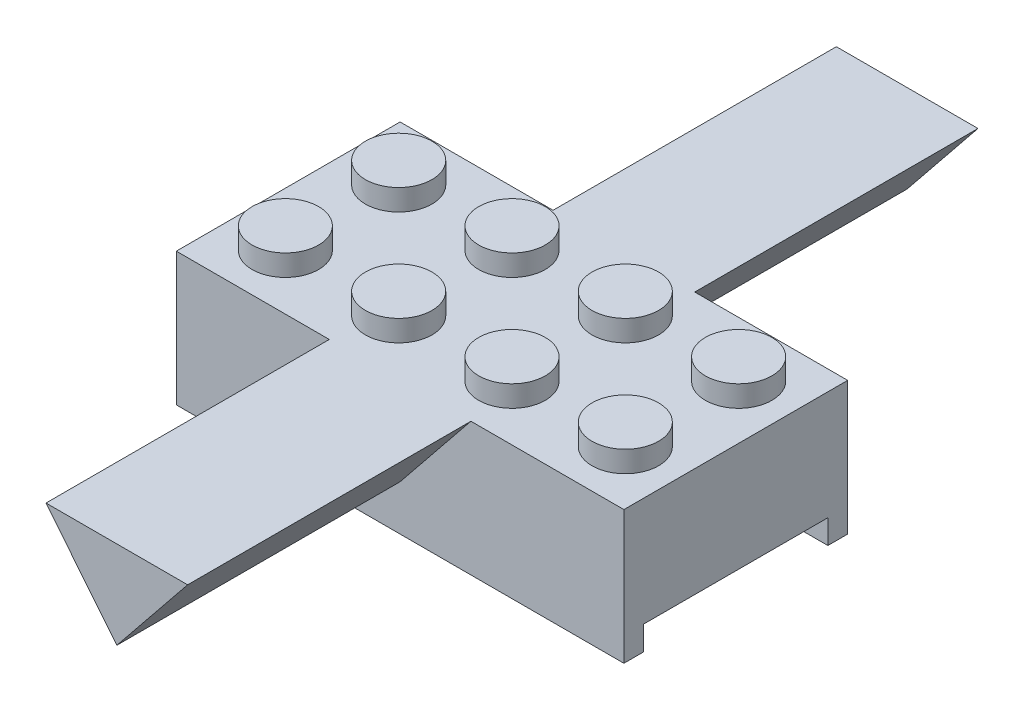
ISO-10303-21;
HEADER;
FILE_DESCRIPTION(('STEP AP214'),'2;1');
FILE_NAME('part.step','',(''),(''),'','','');
FILE_SCHEMA(('AUTOMOTIVE_DESIGN { 1 0 10303 214 1 1 1 1 }'));
ENDSEC;
DATA;
#1=APPLICATION_CONTEXT('core data for automotive mechanical design processes');
#2=APPLICATION_PROTOCOL_DEFINITION('international standard','automotive_design',2000,#1);
#3=PRODUCT_CONTEXT('',#1,'mechanical');
#4=PRODUCT('Part','Part','',(#3));
#5=PRODUCT_RELATED_PRODUCT_CATEGORY('part','',(#4));
#6=PRODUCT_DEFINITION_FORMATION('','',#4);
#7=PRODUCT_DEFINITION_CONTEXT('part definition',#1,'design');
#8=PRODUCT_DEFINITION('design','',#6,#7);
#9=PRODUCT_DEFINITION_SHAPE('','',#8);
#10=(LENGTH_UNIT() NAMED_UNIT(*) SI_UNIT(.MILLI.,.METRE.));
#11=(NAMED_UNIT(*) PLANE_ANGLE_UNIT() SI_UNIT($,.RADIAN.));
#12=(NAMED_UNIT(*) SI_UNIT($,.STERADIAN.) SOLID_ANGLE_UNIT());
#13=UNCERTAINTY_MEASURE_WITH_UNIT(LENGTH_MEASURE(1.E-05),#10,'distance_accuracy_value','');
#14=(GEOMETRIC_REPRESENTATION_CONTEXT(3) GLOBAL_UNCERTAINTY_ASSIGNED_CONTEXT((#13)) GLOBAL_UNIT_ASSIGNED_CONTEXT((#10,
#11,#12)) REPRESENTATION_CONTEXT('',''));
#15=CARTESIAN_POINT('',(0.,0.,0.));
#16=DIRECTION('',(0.,0.,1.));
#17=DIRECTION('',(1.,0.,0.));
#18=AXIS2_PLACEMENT_3D('',#15,#16,#17);
#19=CARTESIAN_POINT('',(-17.1542857142857,9.4,8.35142857142857));
#20=DIRECTION('',(0.,0.,-1.));
#21=DIRECTION('',(-1.,0.,0.));
#22=AXIS2_PLACEMENT_3D('',#19,#20,#21);
#23=PLANE('',#22);
#24=DIRECTION('',(0.627752451189782,0.778413039475329,0.));
#25=VECTOR('',#24,1.);
#26=CARTESIAN_POINT('',(-1.35428571428571,3.2,8.35142857142857));
#27=LINE('',#26,#25);
#28=CARTESIAN_POINT('',(-1.35428571428571,3.2,8.35142857142857));
#29=VERTEX_POINT('',#28);
#30=CARTESIAN_POINT('',(3.64571428571429,9.4,8.35142857142857));
#31=VERTEX_POINT('',#30);
#32=EDGE_CURVE('E150',#29,#31,#27,.T.);
#33=ORIENTED_EDGE('',*,*,#32,.F.);
#34=DIRECTION('',(0.627752451189782,-0.778413039475329,0.));
#35=VECTOR('',#34,1.);
#36=CARTESIAN_POINT('',(-6.35428571428572,9.4,8.35142857142857));
#37=LINE('',#36,#35);
#38=CARTESIAN_POINT('',(-6.35428571428571,9.4,8.35142857142857));
#39=VERTEX_POINT('',#38);
#40=EDGE_CURVE('E54',#39,#29,#37,.T.);
#41=ORIENTED_EDGE('',*,*,#40,.F.);
#42=DIRECTION('',(1.,0.,0.));
#43=VECTOR('',#42,1.);
#44=CARTESIAN_POINT('',(-17.1542857142857,9.4,8.35142857142857));
#45=LINE('',#44,#43);
#46=CARTESIAN_POINT('',(-17.1542857142857,9.4,8.35142857142857));
#47=VERTEX_POINT('',#46);
#48=EDGE_CURVE('E154',#47,#39,#45,.T.);
#49=ORIENTED_EDGE('',*,*,#48,.F.);
#50=DIRECTION('',(0.,-1.,0.));
#51=VECTOR('',#50,1.);
#52=CARTESIAN_POINT('',(-17.1542857142857,9.4,8.35142857142857));
#53=LINE('',#52,#51);
#54=CARTESIAN_POINT('',(-17.1542857142857,0.,8.35142857142857));
#55=VERTEX_POINT('',#54);
#56=EDGE_CURVE('E11',#47,#55,#53,.T.);
#57=ORIENTED_EDGE('',*,*,#56,.T.);
#58=DIRECTION('',(1.,0.,0.));
#59=VECTOR('',#58,1.);
#60=CARTESIAN_POINT('',(-17.1542857142857,0.,8.35142857142857));
#61=LINE('',#60,#59);
#62=CARTESIAN_POINT('',(14.4457142857143,0.,8.35142857142857));
#63=VERTEX_POINT('',#62);
#64=EDGE_CURVE('E222',#55,#63,#61,.T.);
#65=ORIENTED_EDGE('',*,*,#64,.T.);
#66=DIRECTION('',(0.,-1.,0.));
#67=VECTOR('',#66,1.);
#68=CARTESIAN_POINT('',(14.4457142857143,9.4,8.35142857142857));
#69=LINE('',#68,#67);
#70=CARTESIAN_POINT('',(14.4457142857143,9.4,8.35142857142857));
#71=VERTEX_POINT('',#70);
#72=EDGE_CURVE('E41',#71,#63,#69,.T.);
#73=ORIENTED_EDGE('',*,*,#72,.F.);
#74=EDGE_CURVE('E48',#31,#71,#45,.T.);
#75=ORIENTED_EDGE('',*,*,#74,.F.);
#76=EDGE_LOOP('',(#33,#41,#49,#57,#65,#73,#75));
#77=FACE_BOUND('',#76,.T.);
#78=ADVANCED_FACE('F33',(#77),#23,.F.);
#79=CARTESIAN_POINT('',(-17.1542857142857,9.4,-7.44857142857143));
#80=DIRECTION('',(0.,0.,1.));
#81=DIRECTION('',(1.,0.,0.));
#82=AXIS2_PLACEMENT_3D('',#79,#80,#81);
#83=PLANE('',#82);
#84=DIRECTION('',(-0.627752451189782,0.778413039475329,0.));
#85=VECTOR('',#84,1.);
#86=CARTESIAN_POINT('',(-1.35428571428571,3.2,-7.44857142857143));
#87=LINE('',#86,#85);
#88=CARTESIAN_POINT('',(-1.35428571428571,3.2,-7.44857142857143));
#89=VERTEX_POINT('',#88);
#90=CARTESIAN_POINT('',(-6.35428571428572,9.4,-7.44857142857143));
#91=VERTEX_POINT('',#90);
#92=EDGE_CURVE('E158',#89,#91,#87,.T.);
#93=ORIENTED_EDGE('',*,*,#92,.F.);
#94=DIRECTION('',(-0.627752451189782,-0.778413039475329,0.));
#95=VECTOR('',#94,1.);
#96=CARTESIAN_POINT('',(3.64571428571429,9.4,-7.44857142857143));
#97=LINE('',#96,#95);
#98=CARTESIAN_POINT('',(3.64571428571428,9.4,-7.44857142857143));
#99=VERTEX_POINT('',#98);
#100=EDGE_CURVE('E155',#99,#89,#97,.T.);
#101=ORIENTED_EDGE('',*,*,#100,.F.);
#102=DIRECTION('',(-1.,0.,0.));
#103=VECTOR('',#102,1.);
#104=CARTESIAN_POINT('',(-17.1542857142857,9.4,-7.44857142857143));
#105=LINE('',#104,#103);
#106=CARTESIAN_POINT('',(14.4457142857143,9.4,-7.44857142857143));
#107=VERTEX_POINT('',#106);
#108=EDGE_CURVE('E215',#107,#99,#105,.T.);
#109=ORIENTED_EDGE('',*,*,#108,.F.);
#110=DIRECTION('',(0.,-1.,0.));
#111=VECTOR('',#110,1.);
#112=CARTESIAN_POINT('',(14.4457142857143,9.4,-7.44857142857143));
#113=LINE('',#112,#111);
#114=CARTESIAN_POINT('',(14.4457142857143,0.,-7.44857142857143));
#115=VERTEX_POINT('',#114);
#116=EDGE_CURVE('E231',#107,#115,#113,.T.);
#117=ORIENTED_EDGE('',*,*,#116,.T.);
#118=DIRECTION('',(-1.,0.,0.));
#119=VECTOR('',#118,1.);
#120=CARTESIAN_POINT('',(-17.1542857142857,0.,-7.44857142857143));
#121=LINE('',#120,#119);
#122=CARTESIAN_POINT('',(-17.1542857142857,0.,-7.44857142857143));
#123=VERTEX_POINT('',#122);
#124=EDGE_CURVE('E210',#115,#123,#121,.T.);
#125=ORIENTED_EDGE('',*,*,#124,.T.);
#126=DIRECTION('',(0.,-1.,0.));
#127=VECTOR('',#126,1.);
#128=CARTESIAN_POINT('',(-17.1542857142857,9.4,-7.44857142857143));
#129=LINE('',#128,#127);
#130=CARTESIAN_POINT('',(-17.1542857142857,9.4,-7.44857142857143));
#131=VERTEX_POINT('',#130);
#132=EDGE_CURVE('E218',#131,#123,#129,.T.);
#133=ORIENTED_EDGE('',*,*,#132,.F.);
#134=EDGE_CURVE('E214',#91,#131,#105,.T.);
#135=ORIENTED_EDGE('',*,*,#134,.F.);
#136=EDGE_LOOP('',(#93,#101,#109,#117,#125,#133,#135));
#137=FACE_BOUND('',#136,.T.);
#138=ADVANCED_FACE('F265',(#137),#83,.F.);
#139=CARTESIAN_POINT('',(0.,0.,0.));
#140=DIRECTION('',(0.,1.,0.));
#141=DIRECTION('',(0.,0.,1.));
#142=AXIS2_PLACEMENT_3D('',#139,#140,#141);
#143=PLANE('',#142);
#144=DIRECTION('',(0.,0.,-1.));
#145=VECTOR('',#144,1.);
#146=CARTESIAN_POINT('',(14.4457142857143,0.,-7.44857142857143));
#147=LINE('',#146,#145);
#148=CARTESIAN_POINT('',(14.4457142857143,0.,-6.04857142857143));
#149=VERTEX_POINT('',#148);
#150=EDGE_CURVE('E224',#149,#115,#147,.T.);
#151=ORIENTED_EDGE('',*,*,#150,.F.);
#152=DIRECTION('',(1.,0.,0.));
#153=VECTOR('',#152,1.);
#154=CARTESIAN_POINT('',(14.4457142857143,0.,-6.04857142857143));
#155=LINE('',#154,#153);
#156=CARTESIAN_POINT('',(-17.1542857142857,0.,-6.04857142857143));
#157=VERTEX_POINT('',#156);
#158=EDGE_CURVE('E187',#157,#149,#155,.T.);
#159=ORIENTED_EDGE('',*,*,#158,.F.);
#160=DIRECTION('',(0.,0.,1.));
#161=VECTOR('',#160,1.);
#162=CARTESIAN_POINT('',(-17.1542857142857,0.,-7.44857142857143));
#163=LINE('',#162,#161);
#164=EDGE_CURVE('E219',#123,#157,#163,.T.);
#165=ORIENTED_EDGE('',*,*,#164,.F.);
#166=ORIENTED_EDGE('',*,*,#124,.F.);
#167=EDGE_LOOP('',(#151,#159,#165,#166));
#168=FACE_BOUND('',#167,.T.);
#169=ADVANCED_FACE('F261',(#168),#143,.F.);
#170=CARTESIAN_POINT('',(-17.1542857142857,9.4,-7.44857142857143));
#171=DIRECTION('',(1.,0.,0.));
#172=DIRECTION('',(0.,0.,-1.));
#173=AXIS2_PLACEMENT_3D('',#170,#171,#172);
#174=PLANE('',#173);
#175=ORIENTED_EDGE('',*,*,#164,.T.);
#176=DIRECTION('',(0.,-1.,0.));
#177=VECTOR('',#176,1.);
#178=CARTESIAN_POINT('',(-17.1542857142857,1.7,-6.04857142857143));
#179=LINE('',#178,#177);
#180=CARTESIAN_POINT('',(-17.1542857142857,1.7,-6.04857142857143));
#181=VERTEX_POINT('',#180);
#182=EDGE_CURVE('E202',#181,#157,#179,.T.);
#183=ORIENTED_EDGE('',*,*,#182,.F.);
#184=DIRECTION('',(0.,0.,-1.));
#185=VECTOR('',#184,1.);
#186=CARTESIAN_POINT('',(-17.1542857142857,1.7,6.95142857142857));
#187=LINE('',#186,#185);
#188=CARTESIAN_POINT('',(-17.1542857142857,1.7,6.95142857142857));
#189=VERTEX_POINT('',#188);
#190=EDGE_CURVE('E190',#189,#181,#187,.T.);
#191=ORIENTED_EDGE('',*,*,#190,.F.);
#192=DIRECTION('',(0.,-1.,0.));
#193=VECTOR('',#192,1.);
#194=CARTESIAN_POINT('',(-17.1542857142857,1.7,6.95142857142857));
#195=LINE('',#194,#193);
#196=CARTESIAN_POINT('',(-17.1542857142857,0.,6.95142857142857));
#197=VERTEX_POINT('',#196);
#198=EDGE_CURVE('E204',#189,#197,#195,.T.);
#199=ORIENTED_EDGE('',*,*,#198,.T.);
#200=EDGE_CURVE('E201',#197,#55,#163,.T.);
#201=ORIENTED_EDGE('',*,*,#200,.T.);
#202=ORIENTED_EDGE('',*,*,#56,.F.);
#203=DIRECTION('',(0.,0.,1.));
#204=VECTOR('',#203,1.);
#205=CARTESIAN_POINT('',(-17.1542857142857,9.4,-7.44857142857143));
#206=LINE('',#205,#204);
#207=EDGE_CURVE('E208',#131,#47,#206,.T.);
#208=ORIENTED_EDGE('',*,*,#207,.F.);
#209=ORIENTED_EDGE('',*,*,#132,.T.);
#210=EDGE_LOOP('',(#175,#183,#191,#199,#201,#202,#208,#209));
#211=FACE_BOUND('',#210,.T.);
#212=ADVANCED_FACE('F35',(#211),#174,.F.);
#213=CARTESIAN_POINT('',(14.4457142857143,9.4,-7.44857142857143));
#214=DIRECTION('',(-1.,0.,0.));
#215=DIRECTION('',(0.,0.,1.));
#216=AXIS2_PLACEMENT_3D('',#213,#214,#215);
#217=PLANE('',#216);
#218=DIRECTION('',(0.,0.,1.));
#219=VECTOR('',#218,1.);
#220=CARTESIAN_POINT('',(14.4457142857143,1.7,6.95142857142857));
#221=LINE('',#220,#219);
#222=CARTESIAN_POINT('',(14.4457142857143,1.7,-6.04857142857143));
#223=VERTEX_POINT('',#222);
#224=CARTESIAN_POINT('',(14.4457142857143,1.7,6.95142857142857));
#225=VERTEX_POINT('',#224);
#226=EDGE_CURVE('E183',#223,#225,#221,.T.);
#227=ORIENTED_EDGE('',*,*,#226,.F.);
#228=DIRECTION('',(0.,-1.,0.));
#229=VECTOR('',#228,1.);
#230=CARTESIAN_POINT('',(14.4457142857143,1.7,-6.04857142857143));
#231=LINE('',#230,#229);
#232=EDGE_CURVE('E198',#223,#149,#231,.T.);
#233=ORIENTED_EDGE('',*,*,#232,.T.);
#234=ORIENTED_EDGE('',*,*,#150,.T.);
#235=ORIENTED_EDGE('',*,*,#116,.F.);
#236=DIRECTION('',(0.,0.,-1.));
#237=VECTOR('',#236,1.);
#238=CARTESIAN_POINT('',(14.4457142857143,9.4,-7.44857142857143));
#239=LINE('',#238,#237);
#240=EDGE_CURVE('E212',#71,#107,#239,.T.);
#241=ORIENTED_EDGE('',*,*,#240,.F.);
#242=ORIENTED_EDGE('',*,*,#72,.T.);
#243=CARTESIAN_POINT('',(14.4457142857143,0.,6.95142857142857));
#244=VERTEX_POINT('',#243);
#245=EDGE_CURVE('E225',#63,#244,#147,.T.);
#246=ORIENTED_EDGE('',*,*,#245,.T.);
#247=DIRECTION('',(0.,-1.,0.));
#248=VECTOR('',#247,1.);
#249=CARTESIAN_POINT('',(14.4457142857143,1.7,6.95142857142857));
#250=LINE('',#249,#248);
#251=EDGE_CURVE('E195',#225,#244,#250,.T.);
#252=ORIENTED_EDGE('',*,*,#251,.F.);
#253=EDGE_LOOP('',(#227,#233,#234,#235,#241,#242,#246,#252));
#254=FACE_BOUND('',#253,.T.);
#255=ADVANCED_FACE('F238',(#254),#217,.F.);
#256=CARTESIAN_POINT('',(0.,9.4,0.));
#257=DIRECTION('',(0.,1.,0.));
#258=DIRECTION('',(0.,0.,1.));
#259=AXIS2_PLACEMENT_3D('',#256,#257,#258);
#260=PLANE('',#259);
#261=CARTESIAN_POINT('',(10.6457142857143,9.4,-3.54857142857143));
#262=DIRECTION('',(0.,1.,0.));
#263=DIRECTION('',(0.,0.,1.));
#264=AXIS2_PLACEMENT_3D('',#261,#262,#263);
#265=CIRCLE('',#264,2.35);
#266=CARTESIAN_POINT('',(10.6457142857143,9.4,-1.19857142857143));
#267=VERTEX_POINT('',#266);
#268=EDGE_CURVE('E325',#267,#267,#265,.T.);
#269=ORIENTED_EDGE('',*,*,#268,.F.);
#270=EDGE_LOOP('',(#269));
#271=FACE_BOUND('',#270,.T.);
#272=CARTESIAN_POINT('',(-13.3542857142857,9.4,-3.54857142857126));
#273=DIRECTION('',(0.,1.,0.));
#274=DIRECTION('',(0.,0.,1.));
#275=AXIS2_PLACEMENT_3D('',#272,#273,#274);
#276=CIRCLE('',#275,2.35);
#277=CARTESIAN_POINT('',(-13.3542857142857,9.4,-1.19857142857126));
#278=VERTEX_POINT('',#277);
#279=EDGE_CURVE('E319',#278,#278,#276,.T.);
#280=ORIENTED_EDGE('',*,*,#279,.F.);
#281=EDGE_LOOP('',(#280));
#282=FACE_BOUND('',#281,.T.);
#283=CARTESIAN_POINT('',(-5.35428571428574,9.4,-3.54857142857132));
#284=DIRECTION('',(0.,1.,0.));
#285=DIRECTION('',(0.,0.,1.));
#286=AXIS2_PLACEMENT_3D('',#283,#284,#285);
#287=CIRCLE('',#286,2.35);
#288=CARTESIAN_POINT('',(-5.35428571428574,9.4,-1.19857142857132));
#289=VERTEX_POINT('',#288);
#290=EDGE_CURVE('E313',#289,#289,#287,.T.);
#291=ORIENTED_EDGE('',*,*,#290,.F.);
#292=EDGE_LOOP('',(#291));
#293=FACE_BOUND('',#292,.T.);
#294=CARTESIAN_POINT('',(2.64571428571426,9.4,-3.54857142857137));
#295=DIRECTION('',(0.,1.,0.));
#296=DIRECTION('',(0.,0.,1.));
#297=AXIS2_PLACEMENT_3D('',#294,#295,#296);
#298=CIRCLE('',#297,2.35);
#299=CARTESIAN_POINT('',(2.64571428571426,9.4,-1.19857142857137));
#300=VERTEX_POINT('',#299);
#301=EDGE_CURVE('E307',#300,#300,#298,.T.);
#302=ORIENTED_EDGE('',*,*,#301,.F.);
#303=EDGE_LOOP('',(#302));
#304=FACE_BOUND('',#303,.T.);
#305=CARTESIAN_POINT('',(-13.3542857142857,9.4,4.45142857142874));
#306=DIRECTION('',(0.,1.,0.));
#307=DIRECTION('',(0.,0.,1.));
#308=AXIS2_PLACEMENT_3D('',#305,#306,#307);
#309=CIRCLE('',#308,2.35);
#310=CARTESIAN_POINT('',(-13.3542857142857,9.4,6.80142857142874));
#311=VERTEX_POINT('',#310);
#312=EDGE_CURVE('E301',#311,#311,#309,.T.);
#313=ORIENTED_EDGE('',*,*,#312,.F.);
#314=EDGE_LOOP('',(#313));
#315=FACE_BOUND('',#314,.T.);
#316=CARTESIAN_POINT('',(-5.35428571428571,9.4,4.45142857142868));
#317=DIRECTION('',(0.,1.,0.));
#318=DIRECTION('',(0.,0.,1.));
#319=AXIS2_PLACEMENT_3D('',#316,#317,#318);
#320=CIRCLE('',#319,2.35);
#321=CARTESIAN_POINT('',(-5.35428571428571,9.4,6.80142857142868));
#322=VERTEX_POINT('',#321);
#323=EDGE_CURVE('E295',#322,#322,#320,.T.);
#324=ORIENTED_EDGE('',*,*,#323,.F.);
#325=EDGE_LOOP('',(#324));
#326=FACE_BOUND('',#325,.T.);
#327=CARTESIAN_POINT('',(2.64571428571429,9.4,4.45142857142863));
#328=DIRECTION('',(0.,1.,0.));
#329=DIRECTION('',(0.,0.,1.));
#330=AXIS2_PLACEMENT_3D('',#327,#328,#329);
#331=CIRCLE('',#330,2.35);
#332=CARTESIAN_POINT('',(2.64571428571429,9.4,6.80142857142863));
#333=VERTEX_POINT('',#332);
#334=EDGE_CURVE('E289',#333,#333,#331,.T.);
#335=ORIENTED_EDGE('',*,*,#334,.F.);
#336=EDGE_LOOP('',(#335));
#337=FACE_BOUND('',#336,.T.);
#338=CARTESIAN_POINT('',(10.6457142857143,9.4,4.45142857142857));
#339=DIRECTION('',(0.,1.,0.));
#340=DIRECTION('',(0.,0.,1.));
#341=AXIS2_PLACEMENT_3D('',#338,#339,#340);
#342=CIRCLE('',#341,2.35);
#343=CARTESIAN_POINT('',(10.6457142857143,9.4,6.80142857142857));
#344=VERTEX_POINT('',#343);
#345=EDGE_CURVE('E283',#344,#344,#342,.T.);
#346=ORIENTED_EDGE('',*,*,#345,.F.);
#347=EDGE_LOOP('',(#346));
#348=FACE_BOUND('',#347,.T.);
#349=ORIENTED_EDGE('',*,*,#207,.T.);
#350=ORIENTED_EDGE('',*,*,#48,.T.);
#351=DIRECTION('',(0.,0.,-1.));
#352=VECTOR('',#351,1.);
#353=CARTESIAN_POINT('',(-6.35428571428572,9.4,28.3514285714286));
#354=LINE('',#353,#352);
#355=CARTESIAN_POINT('',(-6.35428571428572,9.4,28.3514285714286));
#356=VERTEX_POINT('',#355);
#357=EDGE_CURVE('E137',#356,#39,#354,.T.);
#358=ORIENTED_EDGE('',*,*,#357,.F.);
#359=DIRECTION('',(-1.,0.,0.));
#360=VECTOR('',#359,1.);
#361=CARTESIAN_POINT('',(3.64571428571428,9.4,28.3514285714286));
#362=LINE('',#361,#360);
#363=CARTESIAN_POINT('',(3.64571428571428,9.4,28.3514285714286));
#364=VERTEX_POINT('',#363);
#365=EDGE_CURVE('E143',#364,#356,#362,.T.);
#366=ORIENTED_EDGE('',*,*,#365,.F.);
#367=DIRECTION('',(0.,0.,-1.));
#368=VECTOR('',#367,1.);
#369=CARTESIAN_POINT('',(3.64571428571428,9.4,28.3514285714286));
#370=LINE('',#369,#368);
#371=EDGE_CURVE('E160',#364,#31,#370,.T.);
#372=ORIENTED_EDGE('',*,*,#371,.T.);
#373=ORIENTED_EDGE('',*,*,#74,.T.);
#374=ORIENTED_EDGE('',*,*,#240,.T.);
#375=ORIENTED_EDGE('',*,*,#108,.T.);
#376=DIRECTION('',(0.,0.,1.));
#377=VECTOR('',#376,1.);
#378=CARTESIAN_POINT('',(3.64571428571429,9.4,-27.4485714285714));
#379=LINE('',#378,#377);
#380=CARTESIAN_POINT('',(3.64571428571429,9.4,-27.4485714285714));
#381=VERTEX_POINT('',#380);
#382=EDGE_CURVE('E179',#381,#99,#379,.T.);
#383=ORIENTED_EDGE('',*,*,#382,.F.);
#384=DIRECTION('',(1.,0.,0.));
#385=VECTOR('',#384,1.);
#386=CARTESIAN_POINT('',(3.64571428571429,9.4,-27.4485714285714));
#387=LINE('',#386,#385);
#388=CARTESIAN_POINT('',(-6.35428571428571,9.4,-27.4485714285714));
#389=VERTEX_POINT('',#388);
#390=EDGE_CURVE('E164',#389,#381,#387,.T.);
#391=ORIENTED_EDGE('',*,*,#390,.F.);
#392=DIRECTION('',(0.,0.,1.));
#393=VECTOR('',#392,1.);
#394=CARTESIAN_POINT('',(-6.35428571428571,9.4,-27.4485714285714));
#395=LINE('',#394,#393);
#396=EDGE_CURVE('E170',#389,#91,#395,.T.);
#397=ORIENTED_EDGE('',*,*,#396,.T.);
#398=ORIENTED_EDGE('',*,*,#134,.T.);
#399=EDGE_LOOP('',(#349,#350,#358,#366,#372,#373,#374,#375,#383,#391,#397,#398));
#400=FACE_BOUND('',#399,.T.);
#401=ADVANCED_FACE('F153',(#271,#282,#293,#304,#315,#326,#337,#348,#400),#260,.T.);
#402=ORIENTED_EDGE('',*,*,#200,.F.);
#403=DIRECTION('',(-1.,0.,0.));
#404=VECTOR('',#403,1.);
#405=CARTESIAN_POINT('',(14.4457142857143,0.,6.95142857142857));
#406=LINE('',#405,#404);
#407=EDGE_CURVE('E182',#244,#197,#406,.T.);
#408=ORIENTED_EDGE('',*,*,#407,.F.);
#409=ORIENTED_EDGE('',*,*,#245,.F.);
#410=ORIENTED_EDGE('',*,*,#64,.F.);
#411=EDGE_LOOP('',(#402,#408,#409,#410));
#412=FACE_BOUND('',#411,.T.);
#413=ADVANCED_FACE('F245',(#412),#143,.F.);
#414=CARTESIAN_POINT('',(14.4457142857143,1.7,-6.04857142857143));
#415=DIRECTION('',(0.,0.,-1.));
#416=DIRECTION('',(-1.,0.,0.));
#417=AXIS2_PLACEMENT_3D('',#414,#415,#416);
#418=PLANE('',#417);
#419=ORIENTED_EDGE('',*,*,#158,.T.);
#420=ORIENTED_EDGE('',*,*,#232,.F.);
#421=DIRECTION('',(1.,0.,0.));
#422=VECTOR('',#421,1.);
#423=CARTESIAN_POINT('',(14.4457142857143,1.7,-6.04857142857143));
#424=LINE('',#423,#422);
#425=EDGE_CURVE('E192',#181,#223,#424,.T.);
#426=ORIENTED_EDGE('',*,*,#425,.F.);
#427=ORIENTED_EDGE('',*,*,#182,.T.);
#428=EDGE_LOOP('',(#419,#420,#426,#427));
#429=FACE_BOUND('',#428,.T.);
#430=ADVANCED_FACE('F256',(#429),#418,.F.);
#431=CARTESIAN_POINT('',(14.4457142857143,1.7,6.95142857142857));
#432=DIRECTION('',(0.,0.,1.));
#433=DIRECTION('',(1.,0.,0.));
#434=AXIS2_PLACEMENT_3D('',#431,#432,#433);
#435=PLANE('',#434);
#436=ORIENTED_EDGE('',*,*,#407,.T.);
#437=ORIENTED_EDGE('',*,*,#198,.F.);
#438=DIRECTION('',(-1.,0.,0.));
#439=VECTOR('',#438,1.);
#440=CARTESIAN_POINT('',(14.4457142857143,1.7,6.95142857142857));
#441=LINE('',#440,#439);
#442=EDGE_CURVE('E186',#225,#189,#441,.T.);
#443=ORIENTED_EDGE('',*,*,#442,.F.);
#444=ORIENTED_EDGE('',*,*,#251,.T.);
#445=EDGE_LOOP('',(#436,#437,#443,#444));
#446=FACE_BOUND('',#445,.T.);
#447=ADVANCED_FACE('F247',(#446),#435,.F.);
#448=CARTESIAN_POINT('',(0.,1.7,0.));
#449=DIRECTION('',(0.,1.,0.));
#450=DIRECTION('',(0.,0.,1.));
#451=AXIS2_PLACEMENT_3D('',#448,#449,#450);
#452=PLANE('',#451);
#453=ORIENTED_EDGE('',*,*,#226,.T.);
#454=ORIENTED_EDGE('',*,*,#442,.T.);
#455=ORIENTED_EDGE('',*,*,#190,.T.);
#456=ORIENTED_EDGE('',*,*,#425,.T.);
#457=EDGE_LOOP('',(#453,#454,#455,#456));
#458=FACE_BOUND('',#457,.T.);
#459=ADVANCED_FACE('F254',(#458),#452,.F.);
#460=CARTESIAN_POINT('',(3.64571428571429,9.4,-27.4485714285714));
#461=DIRECTION('',(-0.778413039475329,0.627752451189782,0.));
#462=DIRECTION('',(-0.627752451189782,-0.778413039475329,0.));
#463=AXIS2_PLACEMENT_3D('',#460,#461,#462);
#464=PLANE('',#463);
#465=ORIENTED_EDGE('',*,*,#100,.T.);
#466=DIRECTION('',(0.,0.,1.));
#467=VECTOR('',#466,1.);
#468=CARTESIAN_POINT('',(-1.35428571428571,3.2,-27.4485714285714));
#469=LINE('',#468,#467);
#470=CARTESIAN_POINT('',(-1.35428571428571,3.2,-27.4485714285714));
#471=VERTEX_POINT('',#470);
#472=EDGE_CURVE('E176',#471,#89,#469,.T.);
#473=ORIENTED_EDGE('',*,*,#472,.F.);
#474=DIRECTION('',(-0.627752451189782,-0.778413039475329,0.));
#475=VECTOR('',#474,1.);
#476=CARTESIAN_POINT('',(3.64571428571429,9.4,-27.4485714285714));
#477=LINE('',#476,#475);
#478=EDGE_CURVE('E167',#381,#471,#477,.T.);
#479=ORIENTED_EDGE('',*,*,#478,.F.);
#480=ORIENTED_EDGE('',*,*,#382,.T.);
#481=EDGE_LOOP('',(#465,#473,#479,#480));
#482=FACE_BOUND('',#481,.T.);
#483=ADVANCED_FACE('F275',(#482),#464,.F.);
#484=CARTESIAN_POINT('',(-1.35428571428571,3.2,-27.4485714285714));
#485=DIRECTION('',(0.778413039475329,0.627752451189782,0.));
#486=DIRECTION('',(-0.627752451189782,0.778413039475329,0.));
#487=AXIS2_PLACEMENT_3D('',#484,#485,#486);
#488=PLANE('',#487);
#489=ORIENTED_EDGE('',*,*,#92,.T.);
#490=ORIENTED_EDGE('',*,*,#396,.F.);
#491=DIRECTION('',(-0.627752451189782,0.778413039475329,0.));
#492=VECTOR('',#491,1.);
#493=CARTESIAN_POINT('',(-1.35428571428571,3.2,-27.4485714285714));
#494=LINE('',#493,#492);
#495=EDGE_CURVE('E169',#471,#389,#494,.T.);
#496=ORIENTED_EDGE('',*,*,#495,.F.);
#497=ORIENTED_EDGE('',*,*,#472,.T.);
#498=EDGE_LOOP('',(#489,#490,#496,#497));
#499=FACE_BOUND('',#498,.T.);
#500=ADVANCED_FACE('F271',(#499),#488,.F.);
#501=CARTESIAN_POINT('',(0.,0.,-27.4485714285714));
#502=DIRECTION('',(0.,0.,-1.));
#503=DIRECTION('',(-1.,0.,0.));
#504=AXIS2_PLACEMENT_3D('',#501,#502,#503);
#505=PLANE('',#504);
#506=ORIENTED_EDGE('',*,*,#390,.T.);
#507=ORIENTED_EDGE('',*,*,#478,.T.);
#508=ORIENTED_EDGE('',*,*,#495,.T.);
#509=EDGE_LOOP('',(#506,#507,#508));
#510=FACE_BOUND('',#509,.T.);
#511=ADVANCED_FACE('F392',(#510),#505,.T.);
#512=CARTESIAN_POINT('',(-6.35428571428572,9.4,28.3514285714286));
#513=DIRECTION('',(0.778413039475329,0.627752451189782,0.));
#514=DIRECTION('',(-0.627752451189782,0.778413039475329,0.));
#515=AXIS2_PLACEMENT_3D('',#512,#513,#514);
#516=PLANE('',#515);
#517=ORIENTED_EDGE('',*,*,#40,.T.);
#518=DIRECTION('',(0.,0.,-1.));
#519=VECTOR('',#518,1.);
#520=CARTESIAN_POINT('',(-1.35428571428571,3.2,28.3514285714286));
#521=LINE('',#520,#519);
#522=CARTESIAN_POINT('',(-1.35428571428571,3.2,28.3514285714286));
#523=VERTEX_POINT('',#522);
#524=EDGE_CURVE('E139',#523,#29,#521,.T.);
#525=ORIENTED_EDGE('',*,*,#524,.F.);
#526=DIRECTION('',(0.627752451189782,-0.778413039475329,0.));
#527=VECTOR('',#526,1.);
#528=CARTESIAN_POINT('',(-6.35428571428572,9.4,28.3514285714286));
#529=LINE('',#528,#527);
#530=EDGE_CURVE('E133',#356,#523,#529,.T.);
#531=ORIENTED_EDGE('',*,*,#530,.F.);
#532=ORIENTED_EDGE('',*,*,#357,.T.);
#533=EDGE_LOOP('',(#517,#525,#531,#532));
#534=FACE_BOUND('',#533,.T.);
#535=ADVANCED_FACE('F135',(#534),#516,.F.);
#536=CARTESIAN_POINT('',(-1.35428571428571,3.2,28.3514285714286));
#537=DIRECTION('',(-0.778413039475329,0.627752451189782,0.));
#538=DIRECTION('',(-0.627752451189782,-0.77841303947533,0.));
#539=AXIS2_PLACEMENT_3D('',#536,#537,#538);
#540=PLANE('',#539);
#541=ORIENTED_EDGE('',*,*,#32,.T.);
#542=ORIENTED_EDGE('',*,*,#371,.F.);
#543=DIRECTION('',(0.627752451189782,0.778413039475329,0.));
#544=VECTOR('',#543,1.);
#545=CARTESIAN_POINT('',(-1.35428571428571,3.2,28.3514285714286));
#546=LINE('',#545,#544);
#547=EDGE_CURVE('E142',#523,#364,#546,.T.);
#548=ORIENTED_EDGE('',*,*,#547,.F.);
#549=ORIENTED_EDGE('',*,*,#524,.T.);
#550=EDGE_LOOP('',(#541,#542,#548,#549));
#551=FACE_BOUND('',#550,.T.);
#552=ADVANCED_FACE('F369',(#551),#540,.F.);
#553=CARTESIAN_POINT('',(0.,0.,28.3514285714286));
#554=DIRECTION('',(0.,0.,1.));
#555=DIRECTION('',(1.,0.,0.));
#556=AXIS2_PLACEMENT_3D('',#553,#554,#555);
#557=PLANE('',#556);
#558=ORIENTED_EDGE('',*,*,#365,.T.);
#559=ORIENTED_EDGE('',*,*,#530,.T.);
#560=ORIENTED_EDGE('',*,*,#547,.T.);
#561=EDGE_LOOP('',(#558,#559,#560));
#562=FACE_BOUND('',#561,.T.);
#563=ADVANCED_FACE('F146',(#562),#557,.T.);
#564=CARTESIAN_POINT('',(10.6457142857143,10.9,4.45142857142857));
#565=DIRECTION('',(0.,-1.,0.));
#566=DIRECTION('',(0.,0.,-1.));
#567=AXIS2_PLACEMENT_3D('',#564,#565,#566);
#568=CYLINDRICAL_SURFACE('',#567,2.35);
#569=CARTESIAN_POINT('',(10.6457142857143,10.9,4.45142857142857));
#570=DIRECTION('',(0.,1.,0.));
#571=DIRECTION('',(0.,0.,1.));
#572=AXIS2_PLACEMENT_3D('',#569,#570,#571);
#573=CIRCLE('',#572,2.35);
#574=CARTESIAN_POINT('',(10.6457142857143,10.9,6.80142857142857));
#575=VERTEX_POINT('',#574);
#576=EDGE_CURVE('E281',#575,#575,#573,.T.);
#577=ORIENTED_EDGE('',*,*,#576,.F.);
#578=EDGE_LOOP('',(#577));
#579=FACE_BOUND('',#578,.T.);
#580=ORIENTED_EDGE('',*,*,#345,.T.);
#581=EDGE_LOOP('',(#580));
#582=FACE_BOUND('',#581,.T.);
#583=ADVANCED_FACE('F357',(#579,#582),#568,.T.);
#584=CARTESIAN_POINT('',(10.6457142857143,10.9,4.45142857142857));
#585=DIRECTION('',(0.,1.,0.));
#586=DIRECTION('',(0.,0.,1.));
#587=AXIS2_PLACEMENT_3D('',#584,#585,#586);
#588=PLANE('',#587);
#589=ORIENTED_EDGE('',*,*,#576,.T.);
#590=EDGE_LOOP('',(#589));
#591=FACE_BOUND('',#590,.T.);
#592=ADVANCED_FACE('F359',(#591),#588,.T.);
#593=CARTESIAN_POINT('',(2.64571428571429,10.9,4.45142857142863));
#594=DIRECTION('',(0.,-1.,0.));
#595=DIRECTION('',(0.,0.,-1.));
#596=AXIS2_PLACEMENT_3D('',#593,#594,#595);
#597=CYLINDRICAL_SURFACE('',#596,2.35);
#598=CARTESIAN_POINT('',(2.64571428571429,10.9,4.45142857142863));
#599=DIRECTION('',(0.,1.,0.));
#600=DIRECTION('',(0.,0.,1.));
#601=AXIS2_PLACEMENT_3D('',#598,#599,#600);
#602=CIRCLE('',#601,2.35);
#603=CARTESIAN_POINT('',(2.64571428571429,10.9,6.80142857142863));
#604=VERTEX_POINT('',#603);
#605=EDGE_CURVE('E286',#604,#604,#602,.T.);
#606=ORIENTED_EDGE('',*,*,#605,.F.);
#607=EDGE_LOOP('',(#606));
#608=FACE_BOUND('',#607,.T.);
#609=ORIENTED_EDGE('',*,*,#334,.T.);
#610=EDGE_LOOP('',(#609));
#611=FACE_BOUND('',#610,.T.);
#612=ADVANCED_FACE('F366',(#608,#611),#597,.T.);
#613=CARTESIAN_POINT('',(2.64571428571429,10.9,4.45142857142863));
#614=DIRECTION('',(0.,1.,0.));
#615=DIRECTION('',(0.,0.,1.));
#616=AXIS2_PLACEMENT_3D('',#613,#614,#615);
#617=PLANE('',#616);
#618=ORIENTED_EDGE('',*,*,#605,.T.);
#619=EDGE_LOOP('',(#618));
#620=FACE_BOUND('',#619,.T.);
#621=ADVANCED_FACE('F435',(#620),#617,.T.);
#622=CARTESIAN_POINT('',(-5.35428571428571,10.9,4.45142857142868));
#623=DIRECTION('',(0.,-1.,0.));
#624=DIRECTION('',(0.,0.,-1.));
#625=AXIS2_PLACEMENT_3D('',#622,#623,#624);
#626=CYLINDRICAL_SURFACE('',#625,2.35);
#627=CARTESIAN_POINT('',(-5.35428571428571,10.9,4.45142857142868));
#628=DIRECTION('',(0.,1.,0.));
#629=DIRECTION('',(0.,0.,1.));
#630=AXIS2_PLACEMENT_3D('',#627,#628,#629);
#631=CIRCLE('',#630,2.35);
#632=CARTESIAN_POINT('',(-5.35428571428571,10.9,6.80142857142868));
#633=VERTEX_POINT('',#632);
#634=EDGE_CURVE('E292',#633,#633,#631,.T.);
#635=ORIENTED_EDGE('',*,*,#634,.F.);
#636=EDGE_LOOP('',(#635));
#637=FACE_BOUND('',#636,.T.);
#638=ORIENTED_EDGE('',*,*,#323,.T.);
#639=EDGE_LOOP('',(#638));
#640=FACE_BOUND('',#639,.T.);
#641=ADVANCED_FACE('F445',(#637,#640),#626,.T.);
#642=CARTESIAN_POINT('',(-5.35428571428571,10.9,4.45142857142868));
#643=DIRECTION('',(0.,1.,0.));
#644=DIRECTION('',(0.,0.,1.));
#645=AXIS2_PLACEMENT_3D('',#642,#643,#644);
#646=PLANE('',#645);
#647=ORIENTED_EDGE('',*,*,#634,.T.);
#648=EDGE_LOOP('',(#647));
#649=FACE_BOUND('',#648,.T.);
#650=ADVANCED_FACE('F455',(#649),#646,.T.);
#651=CARTESIAN_POINT('',(-13.3542857142857,10.9,4.45142857142874));
#652=DIRECTION('',(0.,-1.,0.));
#653=DIRECTION('',(0.,0.,-1.));
#654=AXIS2_PLACEMENT_3D('',#651,#652,#653);
#655=CYLINDRICAL_SURFACE('',#654,2.35);
#656=CARTESIAN_POINT('',(-13.3542857142857,10.9,4.45142857142874));
#657=DIRECTION('',(0.,1.,0.));
#658=DIRECTION('',(0.,0.,1.));
#659=AXIS2_PLACEMENT_3D('',#656,#657,#658);
#660=CIRCLE('',#659,2.35);
#661=CARTESIAN_POINT('',(-13.3542857142857,10.9,6.80142857142874));
#662=VERTEX_POINT('',#661);
#663=EDGE_CURVE('E298',#662,#662,#660,.T.);
#664=ORIENTED_EDGE('',*,*,#663,.F.);
#665=EDGE_LOOP('',(#664));
#666=FACE_BOUND('',#665,.T.);
#667=ORIENTED_EDGE('',*,*,#312,.T.);
#668=EDGE_LOOP('',(#667));
#669=FACE_BOUND('',#668,.T.);
#670=ADVANCED_FACE('F465',(#666,#669),#655,.T.);
#671=CARTESIAN_POINT('',(-13.3542857142857,10.9,4.45142857142874));
#672=DIRECTION('',(0.,1.,0.));
#673=DIRECTION('',(0.,0.,1.));
#674=AXIS2_PLACEMENT_3D('',#671,#672,#673);
#675=PLANE('',#674);
#676=ORIENTED_EDGE('',*,*,#663,.T.);
#677=EDGE_LOOP('',(#676));
#678=FACE_BOUND('',#677,.T.);
#679=ADVANCED_FACE('F475',(#678),#675,.T.);
#680=CARTESIAN_POINT('',(2.64571428571426,10.9,-3.54857142857137));
#681=DIRECTION('',(0.,-1.,0.));
#682=DIRECTION('',(0.,0.,-1.));
#683=AXIS2_PLACEMENT_3D('',#680,#681,#682);
#684=CYLINDRICAL_SURFACE('',#683,2.35);
#685=CARTESIAN_POINT('',(2.64571428571426,10.9,-3.54857142857137));
#686=DIRECTION('',(0.,1.,0.));
#687=DIRECTION('',(0.,0.,1.));
#688=AXIS2_PLACEMENT_3D('',#685,#686,#687);
#689=CIRCLE('',#688,2.35);
#690=CARTESIAN_POINT('',(2.64571428571426,10.9,-1.19857142857137));
#691=VERTEX_POINT('',#690);
#692=EDGE_CURVE('E304',#691,#691,#689,.T.);
#693=ORIENTED_EDGE('',*,*,#692,.F.);
#694=EDGE_LOOP('',(#693));
#695=FACE_BOUND('',#694,.T.);
#696=ORIENTED_EDGE('',*,*,#301,.T.);
#697=EDGE_LOOP('',(#696));
#698=FACE_BOUND('',#697,.T.);
#699=ADVANCED_FACE('F485',(#695,#698),#684,.T.);
#700=CARTESIAN_POINT('',(2.64571428571426,10.9,-3.54857142857137));
#701=DIRECTION('',(0.,1.,0.));
#702=DIRECTION('',(0.,0.,1.));
#703=AXIS2_PLACEMENT_3D('',#700,#701,#702);
#704=PLANE('',#703);
#705=ORIENTED_EDGE('',*,*,#692,.T.);
#706=EDGE_LOOP('',(#705));
#707=FACE_BOUND('',#706,.T.);
#708=ADVANCED_FACE('F495',(#707),#704,.T.);
#709=CARTESIAN_POINT('',(-5.35428571428574,10.9,-3.54857142857132));
#710=DIRECTION('',(0.,-1.,0.));
#711=DIRECTION('',(0.,0.,-1.));
#712=AXIS2_PLACEMENT_3D('',#709,#710,#711);
#713=CYLINDRICAL_SURFACE('',#712,2.35);
#714=CARTESIAN_POINT('',(-5.35428571428574,10.9,-3.54857142857132));
#715=DIRECTION('',(0.,1.,0.));
#716=DIRECTION('',(0.,0.,1.));
#717=AXIS2_PLACEMENT_3D('',#714,#715,#716);
#718=CIRCLE('',#717,2.35);
#719=CARTESIAN_POINT('',(-5.35428571428574,10.9,-1.19857142857132));
#720=VERTEX_POINT('',#719);
#721=EDGE_CURVE('E310',#720,#720,#718,.T.);
#722=ORIENTED_EDGE('',*,*,#721,.F.);
#723=EDGE_LOOP('',(#722));
#724=FACE_BOUND('',#723,.T.);
#725=ORIENTED_EDGE('',*,*,#290,.T.);
#726=EDGE_LOOP('',(#725));
#727=FACE_BOUND('',#726,.T.);
#728=ADVANCED_FACE('F505',(#724,#727),#713,.T.);
#729=CARTESIAN_POINT('',(-5.35428571428574,10.9,-3.54857142857132));
#730=DIRECTION('',(0.,1.,0.));
#731=DIRECTION('',(0.,0.,1.));
#732=AXIS2_PLACEMENT_3D('',#729,#730,#731);
#733=PLANE('',#732);
#734=ORIENTED_EDGE('',*,*,#721,.T.);
#735=EDGE_LOOP('',(#734));
#736=FACE_BOUND('',#735,.T.);
#737=ADVANCED_FACE('F515',(#736),#733,.T.);
#738=CARTESIAN_POINT('',(-13.3542857142857,10.9,-3.54857142857126));
#739=DIRECTION('',(0.,-1.,0.));
#740=DIRECTION('',(0.,0.,-1.));
#741=AXIS2_PLACEMENT_3D('',#738,#739,#740);
#742=CYLINDRICAL_SURFACE('',#741,2.35);
#743=CARTESIAN_POINT('',(-13.3542857142857,10.9,-3.54857142857126));
#744=DIRECTION('',(0.,1.,0.));
#745=DIRECTION('',(0.,0.,1.));
#746=AXIS2_PLACEMENT_3D('',#743,#744,#745);
#747=CIRCLE('',#746,2.35);
#748=CARTESIAN_POINT('',(-13.3542857142857,10.9,-1.19857142857126));
#749=VERTEX_POINT('',#748);
#750=EDGE_CURVE('E316',#749,#749,#747,.T.);
#751=ORIENTED_EDGE('',*,*,#750,.F.);
#752=EDGE_LOOP('',(#751));
#753=FACE_BOUND('',#752,.T.);
#754=ORIENTED_EDGE('',*,*,#279,.T.);
#755=EDGE_LOOP('',(#754));
#756=FACE_BOUND('',#755,.T.);
#757=ADVANCED_FACE('F525',(#753,#756),#742,.T.);
#758=CARTESIAN_POINT('',(-13.3542857142857,10.9,-3.54857142857126));
#759=DIRECTION('',(0.,1.,0.));
#760=DIRECTION('',(0.,0.,1.));
#761=AXIS2_PLACEMENT_3D('',#758,#759,#760);
#762=PLANE('',#761);
#763=ORIENTED_EDGE('',*,*,#750,.T.);
#764=EDGE_LOOP('',(#763));
#765=FACE_BOUND('',#764,.T.);
#766=ADVANCED_FACE('F336',(#765),#762,.T.);
#767=CARTESIAN_POINT('',(10.6457142857143,10.9,-3.54857142857143));
#768=DIRECTION('',(0.,-1.,0.));
#769=DIRECTION('',(0.,0.,-1.));
#770=AXIS2_PLACEMENT_3D('',#767,#768,#769);
#771=CYLINDRICAL_SURFACE('',#770,2.35);
#772=CARTESIAN_POINT('',(10.6457142857143,10.9,-3.54857142857143));
#773=DIRECTION('',(0.,1.,0.));
#774=DIRECTION('',(0.,0.,1.));
#775=AXIS2_PLACEMENT_3D('',#772,#773,#774);
#776=CIRCLE('',#775,2.35);
#777=CARTESIAN_POINT('',(10.6457142857143,10.9,-1.19857142857143));
#778=VERTEX_POINT('',#777);
#779=EDGE_CURVE('E322',#778,#778,#776,.T.);
#780=ORIENTED_EDGE('',*,*,#779,.F.);
#781=EDGE_LOOP('',(#780));
#782=FACE_BOUND('',#781,.T.);
#783=ORIENTED_EDGE('',*,*,#268,.T.);
#784=EDGE_LOOP('',(#783));
#785=FACE_BOUND('',#784,.T.);
#786=ADVANCED_FACE('F333',(#782,#785),#771,.T.);
#787=CARTESIAN_POINT('',(10.6457142857143,10.9,-3.54857142857143));
#788=DIRECTION('',(0.,1.,0.));
#789=DIRECTION('',(0.,0.,1.));
#790=AXIS2_PLACEMENT_3D('',#787,#788,#789);
#791=PLANE('',#790);
#792=ORIENTED_EDGE('',*,*,#779,.T.);
#793=EDGE_LOOP('',(#792));
#794=FACE_BOUND('',#793,.T.);
#795=ADVANCED_FACE('F331',(#794),#791,.T.);
#796=CLOSED_SHELL('',(#78,#138,#169,#212,#255,#401,#413,#430,#447,#459,#483,#500,#511,#535,#552,
#563,#583,#592,#612,#621,#641,#650,#670,#679,#699,#708,#728,#737,#757,#766,#786,#795));
#797=MANIFOLD_SOLID_BREP('B2',#796);
#798=ADVANCED_BREP_SHAPE_REPRESENTATION('',(#18,#797),#14);
#799=SHAPE_DEFINITION_REPRESENTATION(#9,#798);
ENDSEC;
END-ISO-10303-21;
